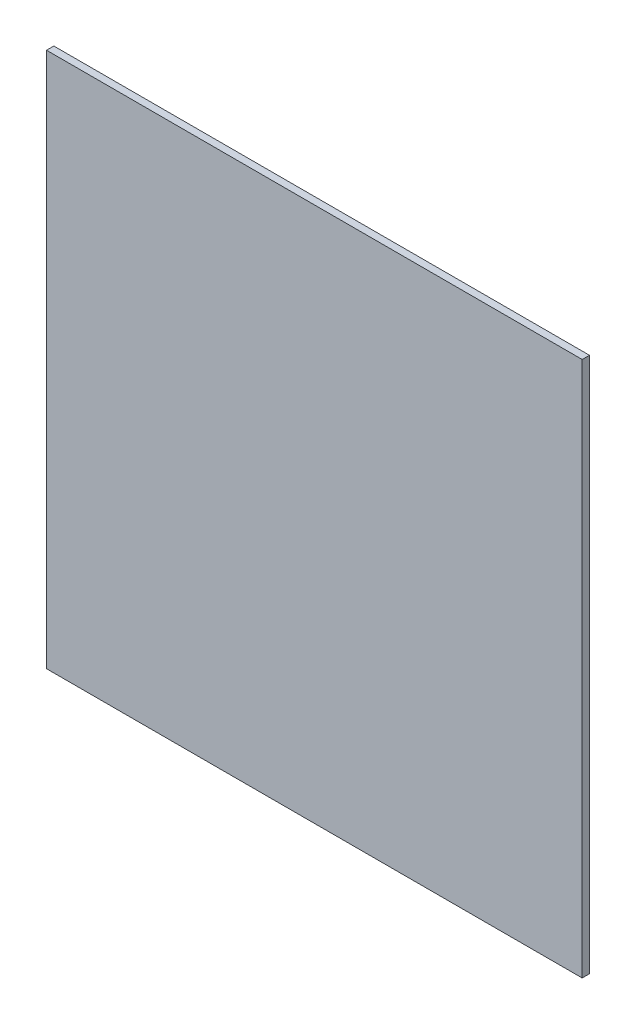
ISO-10303-21;
HEADER;
FILE_DESCRIPTION(('STEP AP214'),'2;1');
FILE_NAME('part.step','',(''),(''),'','','');
FILE_SCHEMA(('AUTOMOTIVE_DESIGN { 1 0 10303 214 1 1 1 1 }'));
ENDSEC;
DATA;
#1=APPLICATION_CONTEXT('core data for automotive mechanical design processes');
#2=APPLICATION_PROTOCOL_DEFINITION('international standard','automotive_design',2000,#1);
#3=PRODUCT_CONTEXT('',#1,'mechanical');
#4=PRODUCT('Part','Part','',(#3));
#5=PRODUCT_RELATED_PRODUCT_CATEGORY('part','',(#4));
#6=PRODUCT_DEFINITION_FORMATION('','',#4);
#7=PRODUCT_DEFINITION_CONTEXT('part definition',#1,'design');
#8=PRODUCT_DEFINITION('design','',#6,#7);
#9=PRODUCT_DEFINITION_SHAPE('','',#8);
#10=(LENGTH_UNIT() NAMED_UNIT(*) SI_UNIT(.MILLI.,.METRE.));
#11=(NAMED_UNIT(*) PLANE_ANGLE_UNIT() SI_UNIT($,.RADIAN.));
#12=(NAMED_UNIT(*) SI_UNIT($,.STERADIAN.) SOLID_ANGLE_UNIT());
#13=UNCERTAINTY_MEASURE_WITH_UNIT(LENGTH_MEASURE(1.E-05),#10,'distance_accuracy_value','');
#14=(GEOMETRIC_REPRESENTATION_CONTEXT(3) GLOBAL_UNCERTAINTY_ASSIGNED_CONTEXT((#13)) GLOBAL_UNIT_ASSIGNED_CONTEXT((#10,
#11,#12)) REPRESENTATION_CONTEXT('',''));
#15=CARTESIAN_POINT('',(0.,0.,0.));
#16=DIRECTION('',(0.,0.,1.));
#17=DIRECTION('',(1.,0.,0.));
#18=AXIS2_PLACEMENT_3D('',#15,#16,#17);
#19=CARTESIAN_POINT('',(110.,110.,3.));
#20=DIRECTION('',(-1.,0.,0.));
#21=DIRECTION('',(0.,-1.,0.));
#22=AXIS2_PLACEMENT_3D('',#19,#20,#21);
#23=PLANE('',#22);
#24=DIRECTION('',(0.,1.,0.));
#25=VECTOR('',#24,1.);
#26=CARTESIAN_POINT('',(110.,110.,0.));
#27=LINE('',#26,#25);
#28=CARTESIAN_POINT('',(110.,-110.,0.));
#29=VERTEX_POINT('',#28);
#30=CARTESIAN_POINT('',(110.,110.,0.));
#31=VERTEX_POINT('',#30);
#32=EDGE_CURVE('E98',#29,#31,#27,.T.);
#33=ORIENTED_EDGE('',*,*,#32,.T.);
#34=DIRECTION('',(0.,0.,-1.));
#35=VECTOR('',#34,1.);
#36=CARTESIAN_POINT('',(110.,110.,3.));
#37=LINE('',#36,#35);
#38=CARTESIAN_POINT('',(110.,110.,3.));
#39=VERTEX_POINT('',#38);
#40=EDGE_CURVE('E11',#39,#31,#37,.T.);
#41=ORIENTED_EDGE('',*,*,#40,.F.);
#42=DIRECTION('',(0.,1.,0.));
#43=VECTOR('',#42,1.);
#44=CARTESIAN_POINT('',(110.,110.,3.));
#45=LINE('',#44,#43);
#46=CARTESIAN_POINT('',(110.,-110.,3.));
#47=VERTEX_POINT('',#46);
#48=EDGE_CURVE('E86',#47,#39,#45,.T.);
#49=ORIENTED_EDGE('',*,*,#48,.F.);
#50=DIRECTION('',(0.,0.,-1.));
#51=VECTOR('',#50,1.);
#52=CARTESIAN_POINT('',(110.,-110.,3.));
#53=LINE('',#52,#51);
#54=EDGE_CURVE('E94',#47,#29,#53,.T.);
#55=ORIENTED_EDGE('',*,*,#54,.T.);
#56=EDGE_LOOP('',(#33,#41,#49,#55));
#57=FACE_BOUND('',#56,.T.);
#58=ADVANCED_FACE('F35',(#57),#23,.F.);
#59=CARTESIAN_POINT('',(-110.,110.,3.));
#60=DIRECTION('',(0.,-1.,0.));
#61=DIRECTION('',(0.,0.,-1.));
#62=AXIS2_PLACEMENT_3D('',#59,#60,#61);
#63=PLANE('',#62);
#64=DIRECTION('',(-1.,0.,0.));
#65=VECTOR('',#64,1.);
#66=CARTESIAN_POINT('',(-110.,110.,0.));
#67=LINE('',#66,#65);
#68=CARTESIAN_POINT('',(-110.,110.,0.));
#69=VERTEX_POINT('',#68);
#70=EDGE_CURVE('E90',#31,#69,#67,.T.);
#71=ORIENTED_EDGE('',*,*,#70,.T.);
#72=DIRECTION('',(0.,0.,-1.));
#73=VECTOR('',#72,1.);
#74=CARTESIAN_POINT('',(-110.,110.,3.));
#75=LINE('',#74,#73);
#76=CARTESIAN_POINT('',(-110.,110.,3.));
#77=VERTEX_POINT('',#76);
#78=EDGE_CURVE('E43',#77,#69,#75,.T.);
#79=ORIENTED_EDGE('',*,*,#78,.F.);
#80=DIRECTION('',(-1.,0.,0.));
#81=VECTOR('',#80,1.);
#82=CARTESIAN_POINT('',(-110.,110.,3.));
#83=LINE('',#82,#81);
#84=EDGE_CURVE('E81',#39,#77,#83,.T.);
#85=ORIENTED_EDGE('',*,*,#84,.F.);
#86=ORIENTED_EDGE('',*,*,#40,.T.);
#87=EDGE_LOOP('',(#71,#79,#85,#86));
#88=FACE_BOUND('',#87,.T.);
#89=ADVANCED_FACE('F89',(#88),#63,.F.);
#90=CARTESIAN_POINT('',(-110.,110.,3.));
#91=DIRECTION('',(1.,0.,0.));
#92=DIRECTION('',(0.,1.,0.));
#93=AXIS2_PLACEMENT_3D('',#90,#91,#92);
#94=PLANE('',#93);
#95=DIRECTION('',(0.,-1.,0.));
#96=VECTOR('',#95,1.);
#97=CARTESIAN_POINT('',(-110.,110.,0.));
#98=LINE('',#97,#96);
#99=CARTESIAN_POINT('',(-110.,-110.,0.));
#100=VERTEX_POINT('',#99);
#101=EDGE_CURVE('E68',#69,#100,#98,.T.);
#102=ORIENTED_EDGE('',*,*,#101,.T.);
#103=DIRECTION('',(0.,0.,-1.));
#104=VECTOR('',#103,1.);
#105=CARTESIAN_POINT('',(-110.,-110.,3.));
#106=LINE('',#105,#104);
#107=CARTESIAN_POINT('',(-110.,-110.,3.));
#108=VERTEX_POINT('',#107);
#109=EDGE_CURVE('E91',#108,#100,#106,.T.);
#110=ORIENTED_EDGE('',*,*,#109,.F.);
#111=DIRECTION('',(0.,-1.,0.));
#112=VECTOR('',#111,1.);
#113=CARTESIAN_POINT('',(-110.,110.,3.));
#114=LINE('',#113,#112);
#115=EDGE_CURVE('E84',#77,#108,#114,.T.);
#116=ORIENTED_EDGE('',*,*,#115,.F.);
#117=ORIENTED_EDGE('',*,*,#78,.T.);
#118=EDGE_LOOP('',(#102,#110,#116,#117));
#119=FACE_BOUND('',#118,.T.);
#120=ADVANCED_FACE('F92',(#119),#94,.F.);
#121=CARTESIAN_POINT('',(-110.,-110.,3.));
#122=DIRECTION('',(0.,1.,0.));
#123=DIRECTION('',(0.,0.,1.));
#124=AXIS2_PLACEMENT_3D('',#121,#122,#123);
#125=PLANE('',#124);
#126=DIRECTION('',(1.,0.,0.));
#127=VECTOR('',#126,1.);
#128=CARTESIAN_POINT('',(-110.,-110.,0.));
#129=LINE('',#128,#127);
#130=EDGE_CURVE('E74',#100,#29,#129,.T.);
#131=ORIENTED_EDGE('',*,*,#130,.T.);
#132=ORIENTED_EDGE('',*,*,#54,.F.);
#133=DIRECTION('',(1.,0.,0.));
#134=VECTOR('',#133,1.);
#135=CARTESIAN_POINT('',(-110.,-110.,3.));
#136=LINE('',#135,#134);
#137=EDGE_CURVE('E51',#108,#47,#136,.T.);
#138=ORIENTED_EDGE('',*,*,#137,.F.);
#139=ORIENTED_EDGE('',*,*,#109,.T.);
#140=EDGE_LOOP('',(#131,#132,#138,#139));
#141=FACE_BOUND('',#140,.T.);
#142=ADVANCED_FACE('F105',(#141),#125,.F.);
#143=CARTESIAN_POINT('',(0.,0.,3.));
#144=DIRECTION('',(0.,0.,1.));
#145=DIRECTION('',(1.,0.,0.));
#146=AXIS2_PLACEMENT_3D('',#143,#144,#145);
#147=PLANE('',#146);
#148=ORIENTED_EDGE('',*,*,#48,.T.);
#149=ORIENTED_EDGE('',*,*,#84,.T.);
#150=ORIENTED_EDGE('',*,*,#115,.T.);
#151=ORIENTED_EDGE('',*,*,#137,.T.);
#152=EDGE_LOOP('',(#148,#149,#150,#151));
#153=FACE_BOUND('',#152,.T.);
#154=ADVANCED_FACE('F82',(#153),#147,.T.);
#155=CARTESIAN_POINT('',(0.,0.,0.));
#156=DIRECTION('',(0.,0.,1.));
#157=DIRECTION('',(1.,0.,0.));
#158=AXIS2_PLACEMENT_3D('',#155,#156,#157);
#159=PLANE('',#158);
#160=ORIENTED_EDGE('',*,*,#32,.F.);
#161=ORIENTED_EDGE('',*,*,#130,.F.);
#162=ORIENTED_EDGE('',*,*,#101,.F.);
#163=ORIENTED_EDGE('',*,*,#70,.F.);
#164=EDGE_LOOP('',(#160,#161,#162,#163));
#165=FACE_BOUND('',#164,.T.);
#166=ADVANCED_FACE('F108',(#165),#159,.F.);
#167=CLOSED_SHELL('',(#58,#89,#120,#142,#154,#166));
#168=MANIFOLD_SOLID_BREP('B2',#167);
#169=ADVANCED_BREP_SHAPE_REPRESENTATION('',(#18,#168),#14);
#170=SHAPE_DEFINITION_REPRESENTATION(#9,#169);
ENDSEC;
END-ISO-10303-21;
